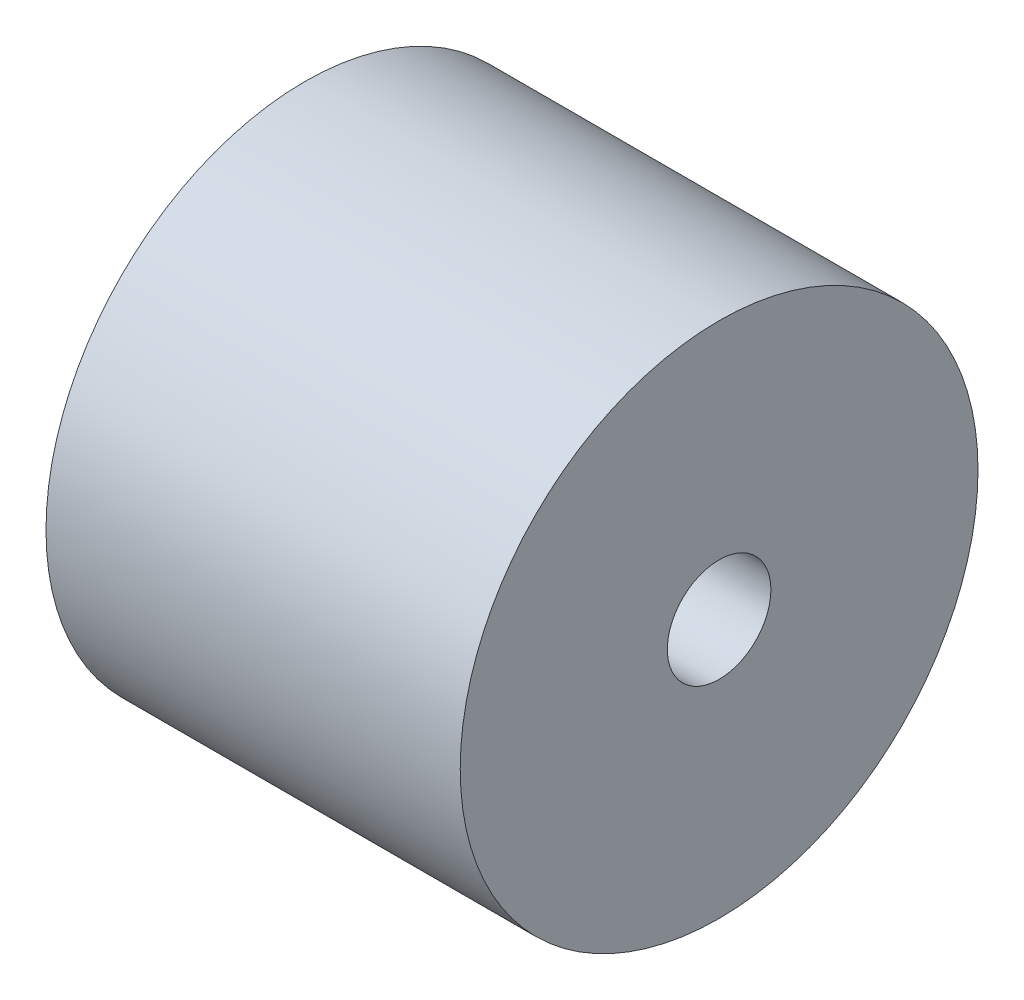
ISO-10303-21;
HEADER;
FILE_DESCRIPTION(('STEP AP214'),'2;1');
FILE_NAME('part.step','',(''),(''),'','','');
FILE_SCHEMA(('AUTOMOTIVE_DESIGN { 1 0 10303 214 1 1 1 1 }'));
ENDSEC;
DATA;
#1=APPLICATION_CONTEXT('core data for automotive mechanical design processes');
#2=APPLICATION_PROTOCOL_DEFINITION('international standard','automotive_design',2000,#1);
#3=PRODUCT_CONTEXT('',#1,'mechanical');
#4=PRODUCT('Part','Part','',(#3));
#5=PRODUCT_RELATED_PRODUCT_CATEGORY('part','',(#4));
#6=PRODUCT_DEFINITION_FORMATION('','',#4);
#7=PRODUCT_DEFINITION_CONTEXT('part definition',#1,'design');
#8=PRODUCT_DEFINITION('design','',#6,#7);
#9=PRODUCT_DEFINITION_SHAPE('','',#8);
#10=(LENGTH_UNIT() NAMED_UNIT(*) SI_UNIT(.MILLI.,.METRE.));
#11=(NAMED_UNIT(*) PLANE_ANGLE_UNIT() SI_UNIT($,.RADIAN.));
#12=(NAMED_UNIT(*) SI_UNIT($,.STERADIAN.) SOLID_ANGLE_UNIT());
#13=UNCERTAINTY_MEASURE_WITH_UNIT(LENGTH_MEASURE(1.E-05),#10,'distance_accuracy_value','');
#14=(GEOMETRIC_REPRESENTATION_CONTEXT(3) GLOBAL_UNCERTAINTY_ASSIGNED_CONTEXT((#13)) GLOBAL_UNIT_ASSIGNED_CONTEXT((#10,
#11,#12)) REPRESENTATION_CONTEXT('',''));
#15=CARTESIAN_POINT('',(0.,0.,0.));
#16=DIRECTION('',(0.,0.,1.));
#17=DIRECTION('',(1.,0.,0.));
#18=AXIS2_PLACEMENT_3D('',#15,#16,#17);
#19=CARTESIAN_POINT('',(16.,0.,0.));
#20=DIRECTION('',(-1.,0.,0.));
#21=DIRECTION('',(0.,0.,1.));
#22=AXIS2_PLACEMENT_3D('',#19,#20,#21);
#23=CYLINDRICAL_SURFACE('',#22,10.);
#24=CARTESIAN_POINT('',(16.,0.,0.));
#25=DIRECTION('',(1.,0.,0.));
#26=DIRECTION('',(0.,0.,-1.));
#27=AXIS2_PLACEMENT_3D('',#24,#25,#26);
#28=CIRCLE('',#27,10.);
#29=CARTESIAN_POINT('',(16.,0.,-10.));
#30=VERTEX_POINT('',#29);
#31=EDGE_CURVE('E10',#30,#30,#28,.T.);
#32=ORIENTED_EDGE('',*,*,#31,.F.);
#33=EDGE_LOOP('',(#32));
#34=FACE_BOUND('',#33,.T.);
#35=CARTESIAN_POINT('',(0.,0.,0.));
#36=DIRECTION('',(1.,0.,0.));
#37=DIRECTION('',(0.,0.,-1.));
#38=AXIS2_PLACEMENT_3D('',#35,#36,#37);
#39=CIRCLE('',#38,10.);
#40=CARTESIAN_POINT('',(0.,0.,-10.));
#41=VERTEX_POINT('',#40);
#42=EDGE_CURVE('E36',#41,#41,#39,.T.);
#43=ORIENTED_EDGE('',*,*,#42,.T.);
#44=EDGE_LOOP('',(#43));
#45=FACE_BOUND('',#44,.T.);
#46=ADVANCED_FACE('F33',(#34,#45),#23,.T.);
#47=CARTESIAN_POINT('',(16.,0.,0.));
#48=DIRECTION('',(1.,0.,0.));
#49=DIRECTION('',(0.,0.,-1.));
#50=AXIS2_PLACEMENT_3D('',#47,#48,#49);
#51=PLANE('',#50);
#52=CARTESIAN_POINT('',(16.,0.,0.));
#53=DIRECTION('',(1.,0.,0.));
#54=DIRECTION('',(0.,0.,-1.));
#55=AXIS2_PLACEMENT_3D('',#52,#53,#54);
#56=CIRCLE('',#55,2.);
#57=CARTESIAN_POINT('',(16.,0.,-2.));
#58=VERTEX_POINT('',#57);
#59=EDGE_CURVE('E45',#58,#58,#56,.T.);
#60=ORIENTED_EDGE('',*,*,#59,.F.);
#61=EDGE_LOOP('',(#60));
#62=FACE_BOUND('',#61,.T.);
#63=ORIENTED_EDGE('',*,*,#31,.T.);
#64=EDGE_LOOP('',(#63));
#65=FACE_BOUND('',#64,.T.);
#66=ADVANCED_FACE('F60',(#62,#65),#51,.T.);
#67=CARTESIAN_POINT('',(0.,0.,0.));
#68=DIRECTION('',(1.,0.,0.));
#69=DIRECTION('',(0.,0.,-1.));
#70=AXIS2_PLACEMENT_3D('',#67,#68,#69);
#71=PLANE('',#70);
#72=ORIENTED_EDGE('',*,*,#42,.F.);
#73=EDGE_LOOP('',(#72));
#74=FACE_BOUND('',#73,.T.);
#75=ADVANCED_FACE('F56',(#74),#71,.F.);
#76=CARTESIAN_POINT('',(6.00000000000001,0.,0.));
#77=DIRECTION('',(1.,0.,0.));
#78=DIRECTION('',(0.,0.,-1.));
#79=AXIS2_PLACEMENT_3D('',#76,#77,#78);
#80=CYLINDRICAL_SURFACE('',#79,2.);
#81=CARTESIAN_POINT('',(6.00000000000001,0.,0.));
#82=DIRECTION('',(1.,0.,0.));
#83=DIRECTION('',(0.,0.,-1.));
#84=AXIS2_PLACEMENT_3D('',#81,#82,#83);
#85=CIRCLE('',#84,2.);
#86=CARTESIAN_POINT('',(6.00000000000001,0.,-2.));
#87=VERTEX_POINT('',#86);
#88=EDGE_CURVE('E43',#87,#87,#85,.T.);
#89=ORIENTED_EDGE('',*,*,#88,.F.);
#90=EDGE_LOOP('',(#89));
#91=FACE_BOUND('',#90,.T.);
#92=ORIENTED_EDGE('',*,*,#59,.T.);
#93=EDGE_LOOP('',(#92));
#94=FACE_BOUND('',#93,.T.);
#95=ADVANCED_FACE('F53',(#91,#94),#80,.F.);
#96=CARTESIAN_POINT('',(6.00000000000001,0.,0.));
#97=DIRECTION('',(1.,0.,0.));
#98=DIRECTION('',(0.,0.,-1.));
#99=AXIS2_PLACEMENT_3D('',#96,#97,#98);
#100=PLANE('',#99);
#101=ORIENTED_EDGE('',*,*,#88,.T.);
#102=EDGE_LOOP('',(#101));
#103=FACE_BOUND('',#102,.T.);
#104=ADVANCED_FACE('F51',(#103),#100,.T.);
#105=CLOSED_SHELL('',(#46,#66,#75,#95,#104));
#106=MANIFOLD_SOLID_BREP('B2',#105);
#107=ADVANCED_BREP_SHAPE_REPRESENTATION('',(#18,#106),#14);
#108=SHAPE_DEFINITION_REPRESENTATION(#9,#107);
ENDSEC;
END-ISO-10303-21;
